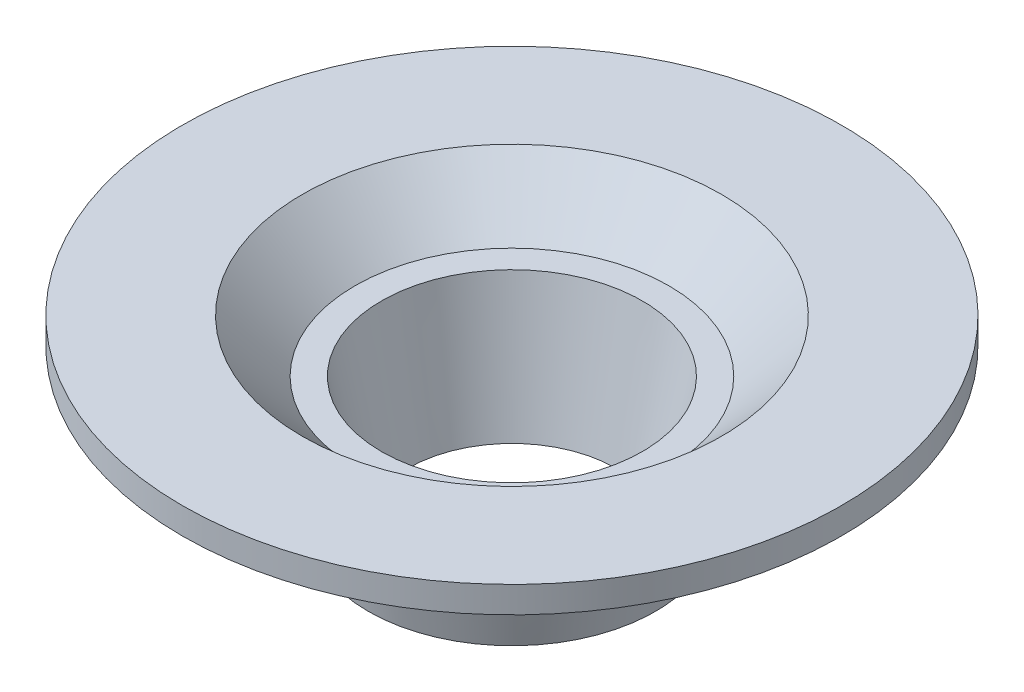
ISO-10303-21;
HEADER;
FILE_DESCRIPTION(('STEP AP214'),'2;1');
FILE_NAME('part.step','',(''),(''),'','','');
FILE_SCHEMA(('AUTOMOTIVE_DESIGN { 1 0 10303 214 1 1 1 1 }'));
ENDSEC;
DATA;
#1=APPLICATION_CONTEXT('core data for automotive mechanical design processes');
#2=APPLICATION_PROTOCOL_DEFINITION('international standard','automotive_design',2000,#1);
#3=PRODUCT_CONTEXT('',#1,'mechanical');
#4=PRODUCT('Part','Part','',(#3));
#5=PRODUCT_RELATED_PRODUCT_CATEGORY('part','',(#4));
#6=PRODUCT_DEFINITION_FORMATION('','',#4);
#7=PRODUCT_DEFINITION_CONTEXT('part definition',#1,'design');
#8=PRODUCT_DEFINITION('design','',#6,#7);
#9=PRODUCT_DEFINITION_SHAPE('','',#8);
#10=(LENGTH_UNIT() NAMED_UNIT(*) SI_UNIT(.MILLI.,.METRE.));
#11=(NAMED_UNIT(*) PLANE_ANGLE_UNIT() SI_UNIT($,.RADIAN.));
#12=(NAMED_UNIT(*) SI_UNIT($,.STERADIAN.) SOLID_ANGLE_UNIT());
#13=UNCERTAINTY_MEASURE_WITH_UNIT(LENGTH_MEASURE(1.E-05),#10,'distance_accuracy_value','');
#14=(GEOMETRIC_REPRESENTATION_CONTEXT(3) GLOBAL_UNCERTAINTY_ASSIGNED_CONTEXT((#13)) GLOBAL_UNIT_ASSIGNED_CONTEXT((#10,
#11,#12)) REPRESENTATION_CONTEXT('',''));
#15=CARTESIAN_POINT('',(0.,0.,0.));
#16=DIRECTION('',(0.,0.,1.));
#17=DIRECTION('',(1.,0.,0.));
#18=AXIS2_PLACEMENT_3D('',#15,#16,#17);
#19=CARTESIAN_POINT('',(0.,0.,0.));
#20=DIRECTION('',(0.,1.,0.));
#21=DIRECTION('',(0.,0.,1.));
#22=AXIS2_PLACEMENT_3D('',#19,#20,#21);
#23=CONICAL_SURFACE('',#22,4.95,0.197395559849881);
#24=CARTESIAN_POINT('',(0.,-5.,0.));
#25=DIRECTION('',(0.,1.,0.));
#26=DIRECTION('',(0.,0.,1.));
#27=AXIS2_PLACEMENT_3D('',#24,#25,#26);
#28=CIRCLE('',#27,3.95);
#29=CARTESIAN_POINT('',(0.,-5.,3.95));
#30=VERTEX_POINT('',#29);
#31=EDGE_CURVE('E80',#30,#30,#28,.T.);
#32=ORIENTED_EDGE('',*,*,#31,.F.);
#33=EDGE_LOOP('',(#32));
#34=FACE_BOUND('',#33,.T.);
#35=CARTESIAN_POINT('',(0.,0.,0.));
#36=DIRECTION('',(0.,1.,0.));
#37=DIRECTION('',(0.,0.,1.));
#38=AXIS2_PLACEMENT_3D('',#35,#36,#37);
#39=CIRCLE('',#38,4.95);
#40=CARTESIAN_POINT('',(0.,0.,4.95));
#41=VERTEX_POINT('',#40);
#42=EDGE_CURVE('E10',#41,#41,#39,.T.);
#43=ORIENTED_EDGE('',*,*,#42,.T.);
#44=EDGE_LOOP('',(#43));
#45=FACE_BOUND('',#44,.T.);
#46=ADVANCED_FACE('F37',(#34,#45),#23,.F.);
#47=CARTESIAN_POINT('',(4.95,0.,0.));
#48=DIRECTION('',(0.,-1.,0.));
#49=DIRECTION('',(0.,0.,-1.));
#50=AXIS2_PLACEMENT_3D('',#47,#48,#49);
#51=PLANE('',#50);
#52=ORIENTED_EDGE('',*,*,#42,.F.);
#53=EDGE_LOOP('',(#52));
#54=FACE_BOUND('',#53,.T.);
#55=CARTESIAN_POINT('',(0.,0.,0.));
#56=DIRECTION('',(0.,1.,0.));
#57=DIRECTION('',(0.,0.,1.));
#58=AXIS2_PLACEMENT_3D('',#55,#56,#57);
#59=CIRCLE('',#58,5.95);
#60=CARTESIAN_POINT('',(0.,0.,5.95));
#61=VERTEX_POINT('',#60);
#62=EDGE_CURVE('E44',#61,#61,#59,.T.);
#63=ORIENTED_EDGE('',*,*,#62,.T.);
#64=EDGE_LOOP('',(#63));
#65=FACE_BOUND('',#64,.T.);
#66=ADVANCED_FACE('F88',(#54,#65),#51,.F.);
#67=CARTESIAN_POINT('',(0.,2.,0.));
#68=DIRECTION('',(0.,1.,0.));
#69=DIRECTION('',(0.,0.,1.));
#70=AXIS2_PLACEMENT_3D('',#67,#68,#69);
#71=CONICAL_SURFACE('',#70,7.95,0.785398163397448);
#72=ORIENTED_EDGE('',*,*,#62,.F.);
#73=EDGE_LOOP('',(#72));
#74=FACE_BOUND('',#73,.T.);
#75=CARTESIAN_POINT('',(0.,2.,0.));
#76=DIRECTION('',(0.,1.,0.));
#77=DIRECTION('',(0.,0.,1.));
#78=AXIS2_PLACEMENT_3D('',#75,#76,#77);
#79=CIRCLE('',#78,7.95);
#80=CARTESIAN_POINT('',(0.,2.,7.95));
#81=VERTEX_POINT('',#80);
#82=EDGE_CURVE('E49',#81,#81,#79,.T.);
#83=ORIENTED_EDGE('',*,*,#82,.T.);
#84=EDGE_LOOP('',(#83));
#85=FACE_BOUND('',#84,.T.);
#86=ADVANCED_FACE('F92',(#74,#85),#71,.F.);
#87=CARTESIAN_POINT('',(7.95,2.,0.));
#88=DIRECTION('',(0.,-1.,0.));
#89=DIRECTION('',(0.,0.,-1.));
#90=AXIS2_PLACEMENT_3D('',#87,#88,#89);
#91=PLANE('',#90);
#92=ORIENTED_EDGE('',*,*,#82,.F.);
#93=EDGE_LOOP('',(#92));
#94=FACE_BOUND('',#93,.T.);
#95=CARTESIAN_POINT('',(0.,2.,0.));
#96=DIRECTION('',(0.,1.,0.));
#97=DIRECTION('',(0.,0.,1.));
#98=AXIS2_PLACEMENT_3D('',#95,#96,#97);
#99=CIRCLE('',#98,12.5);
#100=CARTESIAN_POINT('',(0.,2.,12.5));
#101=VERTEX_POINT('',#100);
#102=EDGE_CURVE('E54',#101,#101,#99,.T.);
#103=ORIENTED_EDGE('',*,*,#102,.T.);
#104=EDGE_LOOP('',(#103));
#105=FACE_BOUND('',#104,.T.);
#106=ADVANCED_FACE('F97',(#94,#105),#91,.F.);
#107=CARTESIAN_POINT('',(0.,0.,0.));
#108=DIRECTION('',(0.,1.,0.));
#109=DIRECTION('',(0.,0.,1.));
#110=AXIS2_PLACEMENT_3D('',#107,#108,#109);
#111=CYLINDRICAL_SURFACE('',#110,12.5);
#112=ORIENTED_EDGE('',*,*,#102,.F.);
#113=EDGE_LOOP('',(#112));
#114=FACE_BOUND('',#113,.T.);
#115=CARTESIAN_POINT('',(0.,1.,0.));
#116=DIRECTION('',(0.,1.,0.));
#117=DIRECTION('',(0.,0.,1.));
#118=AXIS2_PLACEMENT_3D('',#115,#116,#117);
#119=CIRCLE('',#118,12.5);
#120=CARTESIAN_POINT('',(0.,1.,12.5));
#121=VERTEX_POINT('',#120);
#122=EDGE_CURVE('E60',#121,#121,#119,.T.);
#123=ORIENTED_EDGE('',*,*,#122,.T.);
#124=EDGE_LOOP('',(#123));
#125=FACE_BOUND('',#124,.T.);
#126=ADVANCED_FACE('F103',(#114,#125),#111,.T.);
#127=CARTESIAN_POINT('',(12.5,1.,0.));
#128=DIRECTION('',(0.,1.,0.));
#129=DIRECTION('',(0.,0.,1.));
#130=AXIS2_PLACEMENT_3D('',#127,#128,#129);
#131=PLANE('',#130);
#132=ORIENTED_EDGE('',*,*,#122,.F.);
#133=EDGE_LOOP('',(#132));
#134=FACE_BOUND('',#133,.T.);
#135=CARTESIAN_POINT('',(0.,1.,0.));
#136=DIRECTION('',(0.,1.,0.));
#137=DIRECTION('',(0.,0.,1.));
#138=AXIS2_PLACEMENT_3D('',#135,#136,#137);
#139=CIRCLE('',#138,10.5);
#140=CARTESIAN_POINT('',(0.,1.,10.5));
#141=VERTEX_POINT('',#140);
#142=EDGE_CURVE('E64',#141,#141,#139,.T.);
#143=ORIENTED_EDGE('',*,*,#142,.T.);
#144=EDGE_LOOP('',(#143));
#145=FACE_BOUND('',#144,.T.);
#146=ADVANCED_FACE('F107',(#134,#145),#131,.F.);
#147=CARTESIAN_POINT('',(0.,-1.,0.));
#148=DIRECTION('',(0.,1.,0.));
#149=DIRECTION('',(0.,0.,1.));
#150=AXIS2_PLACEMENT_3D('',#147,#148,#149);
#151=CONICAL_SURFACE('',#150,8.5,0.785398163397448);
#152=ORIENTED_EDGE('',*,*,#142,.F.);
#153=EDGE_LOOP('',(#152));
#154=FACE_BOUND('',#153,.T.);
#155=CARTESIAN_POINT('',(0.,-1.,0.));
#156=DIRECTION('',(0.,1.,0.));
#157=DIRECTION('',(0.,0.,1.));
#158=AXIS2_PLACEMENT_3D('',#155,#156,#157);
#159=CIRCLE('',#158,8.5);
#160=CARTESIAN_POINT('',(0.,-1.,8.5));
#161=VERTEX_POINT('',#160);
#162=EDGE_CURVE('E68',#161,#161,#159,.T.);
#163=ORIENTED_EDGE('',*,*,#162,.T.);
#164=EDGE_LOOP('',(#163));
#165=FACE_BOUND('',#164,.T.);
#166=ADVANCED_FACE('F111',(#154,#165),#151,.T.);
#167=CARTESIAN_POINT('',(8.5,-1.,0.));
#168=DIRECTION('',(0.,1.,0.));
#169=DIRECTION('',(0.,0.,1.));
#170=AXIS2_PLACEMENT_3D('',#167,#168,#169);
#171=PLANE('',#170);
#172=ORIENTED_EDGE('',*,*,#162,.F.);
#173=EDGE_LOOP('',(#172));
#174=FACE_BOUND('',#173,.T.);
#175=CARTESIAN_POINT('',(0.,-1.,0.));
#176=DIRECTION('',(0.,1.,0.));
#177=DIRECTION('',(0.,0.,1.));
#178=AXIS2_PLACEMENT_3D('',#175,#176,#177);
#179=CIRCLE('',#178,6.25);
#180=CARTESIAN_POINT('',(0.,-1.,6.25));
#181=VERTEX_POINT('',#180);
#182=EDGE_CURVE('E72',#181,#181,#179,.T.);
#183=ORIENTED_EDGE('',*,*,#182,.T.);
#184=EDGE_LOOP('',(#183));
#185=FACE_BOUND('',#184,.T.);
#186=ADVANCED_FACE('F115',(#174,#185),#171,.F.);
#187=CARTESIAN_POINT('',(0.,-5.,0.));
#188=DIRECTION('',(0.,1.,0.));
#189=DIRECTION('',(0.,0.,1.));
#190=AXIS2_PLACEMENT_3D('',#187,#188,#189);
#191=CONICAL_SURFACE('',#190,5.45,0.19739555984988);
#192=ORIENTED_EDGE('',*,*,#182,.F.);
#193=EDGE_LOOP('',(#192));
#194=FACE_BOUND('',#193,.T.);
#195=CARTESIAN_POINT('',(0.,-5.,0.));
#196=DIRECTION('',(0.,1.,0.));
#197=DIRECTION('',(0.,0.,1.));
#198=AXIS2_PLACEMENT_3D('',#195,#196,#197);
#199=CIRCLE('',#198,5.45);
#200=CARTESIAN_POINT('',(0.,-5.,5.45));
#201=VERTEX_POINT('',#200);
#202=EDGE_CURVE('E76',#201,#201,#199,.T.);
#203=ORIENTED_EDGE('',*,*,#202,.T.);
#204=EDGE_LOOP('',(#203));
#205=FACE_BOUND('',#204,.T.);
#206=ADVANCED_FACE('F119',(#194,#205),#191,.T.);
#207=CARTESIAN_POINT('',(5.45,-5.,0.));
#208=DIRECTION('',(0.,1.,0.));
#209=DIRECTION('',(0.,0.,1.));
#210=AXIS2_PLACEMENT_3D('',#207,#208,#209);
#211=PLANE('',#210);
#212=ORIENTED_EDGE('',*,*,#202,.F.);
#213=EDGE_LOOP('',(#212));
#214=FACE_BOUND('',#213,.T.);
#215=ORIENTED_EDGE('',*,*,#31,.T.);
#216=EDGE_LOOP('',(#215));
#217=FACE_BOUND('',#216,.T.);
#218=ADVANCED_FACE('F85',(#214,#217),#211,.F.);
#219=CLOSED_SHELL('',(#46,#66,#86,#106,#126,#146,#166,#186,#206,#218));
#220=MANIFOLD_SOLID_BREP('B2',#219);
#221=ADVANCED_BREP_SHAPE_REPRESENTATION('',(#18,#220),#14);
#222=SHAPE_DEFINITION_REPRESENTATION(#9,#221);
ENDSEC;
END-ISO-10303-21;
